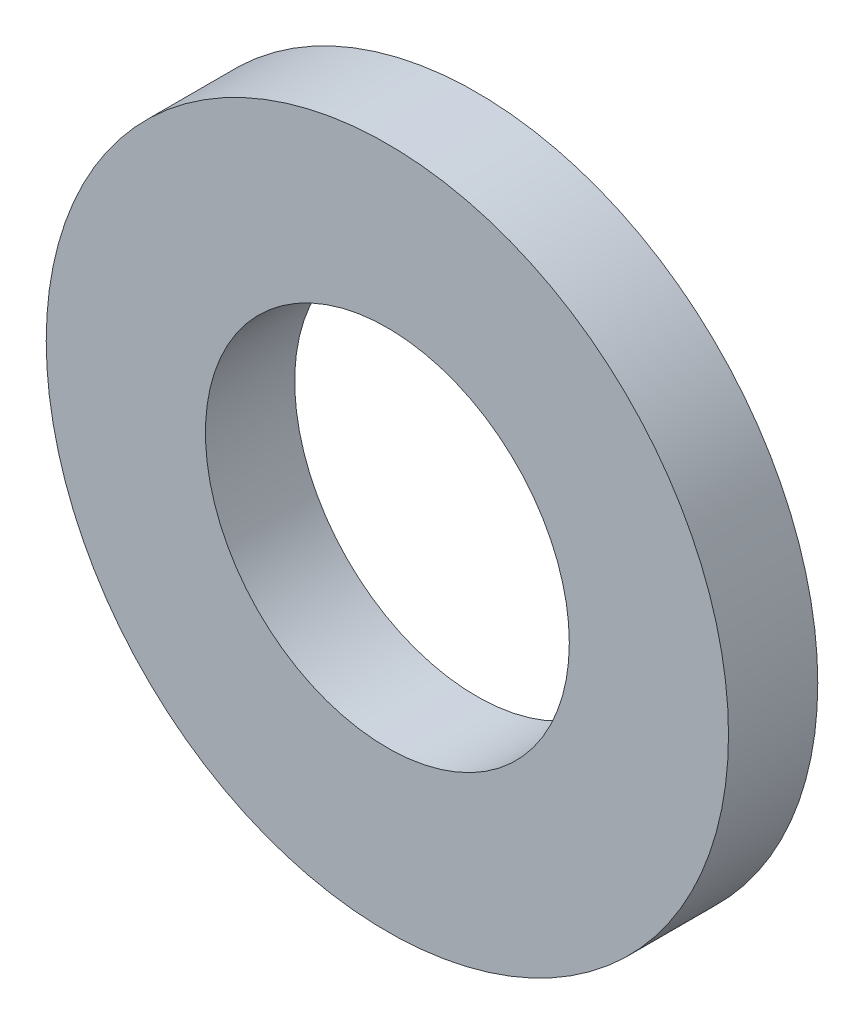
ISO-10303-21;
HEADER;
FILE_DESCRIPTION(('STEP AP214'),'2;1');
FILE_NAME('part.step','',(''),(''),'','','');
FILE_SCHEMA(('AUTOMOTIVE_DESIGN { 1 0 10303 214 1 1 1 1 }'));
ENDSEC;
DATA;
#1=APPLICATION_CONTEXT('core data for automotive mechanical design processes');
#2=APPLICATION_PROTOCOL_DEFINITION('international standard','automotive_design',2000,#1);
#3=PRODUCT_CONTEXT('',#1,'mechanical');
#4=PRODUCT('Part','Part','',(#3));
#5=PRODUCT_RELATED_PRODUCT_CATEGORY('part','',(#4));
#6=PRODUCT_DEFINITION_FORMATION('','',#4);
#7=PRODUCT_DEFINITION_CONTEXT('part definition',#1,'design');
#8=PRODUCT_DEFINITION('design','',#6,#7);
#9=PRODUCT_DEFINITION_SHAPE('','',#8);
#10=(LENGTH_UNIT() NAMED_UNIT(*) SI_UNIT(.MILLI.,.METRE.));
#11=(NAMED_UNIT(*) PLANE_ANGLE_UNIT() SI_UNIT($,.RADIAN.));
#12=(NAMED_UNIT(*) SI_UNIT($,.STERADIAN.) SOLID_ANGLE_UNIT());
#13=UNCERTAINTY_MEASURE_WITH_UNIT(LENGTH_MEASURE(1.E-05),#10,'distance_accuracy_value','');
#14=(GEOMETRIC_REPRESENTATION_CONTEXT(3) GLOBAL_UNCERTAINTY_ASSIGNED_CONTEXT((#13)) GLOBAL_UNIT_ASSIGNED_CONTEXT((#10,
#11,#12)) REPRESENTATION_CONTEXT('',''));
#15=CARTESIAN_POINT('',(0.,0.,0.));
#16=DIRECTION('',(0.,0.,1.));
#17=DIRECTION('',(1.,0.,0.));
#18=AXIS2_PLACEMENT_3D('',#15,#16,#17);
#19=CARTESIAN_POINT('',(0.,0.,-1.57));
#20=DIRECTION('',(0.,0.,1.));
#21=DIRECTION('',(1.,0.,0.));
#22=AXIS2_PLACEMENT_3D('',#19,#20,#21);
#23=CYLINDRICAL_SURFACE('',#22,6.);
#24=CARTESIAN_POINT('',(0.,0.,-1.57));
#25=DIRECTION('',(0.,0.,1.));
#26=DIRECTION('',(1.,0.,0.));
#27=AXIS2_PLACEMENT_3D('',#24,#25,#26);
#28=CIRCLE('',#27,6.);
#29=CARTESIAN_POINT('',(6.,0.,-1.57));
#30=VERTEX_POINT('',#29);
#31=EDGE_CURVE('E10',#30,#30,#28,.T.);
#32=ORIENTED_EDGE('',*,*,#31,.T.);
#33=EDGE_LOOP('',(#32));
#34=FACE_BOUND('',#33,.T.);
#35=CARTESIAN_POINT('',(0.,0.,0.));
#36=DIRECTION('',(0.,0.,1.));
#37=DIRECTION('',(1.,0.,0.));
#38=AXIS2_PLACEMENT_3D('',#35,#36,#37);
#39=CIRCLE('',#38,6.);
#40=CARTESIAN_POINT('',(6.,0.,0.));
#41=VERTEX_POINT('',#40);
#42=EDGE_CURVE('E33',#41,#41,#39,.T.);
#43=ORIENTED_EDGE('',*,*,#42,.F.);
#44=EDGE_LOOP('',(#43));
#45=FACE_BOUND('',#44,.T.);
#46=ADVANCED_FACE('F30',(#34,#45),#23,.T.);
#47=CARTESIAN_POINT('',(0.,0.,-1.57));
#48=DIRECTION('',(0.,0.,1.));
#49=DIRECTION('',(1.,0.,0.));
#50=AXIS2_PLACEMENT_3D('',#47,#48,#49);
#51=PLANE('',#50);
#52=CARTESIAN_POINT('',(0.,0.,-1.57));
#53=DIRECTION('',(0.,0.,1.));
#54=DIRECTION('',(1.,0.,0.));
#55=AXIS2_PLACEMENT_3D('',#52,#53,#54);
#56=CIRCLE('',#55,3.2);
#57=CARTESIAN_POINT('',(3.2,0.,-1.57));
#58=VERTEX_POINT('',#57);
#59=EDGE_CURVE('E40',#58,#58,#56,.T.);
#60=ORIENTED_EDGE('',*,*,#59,.T.);
#61=EDGE_LOOP('',(#60));
#62=FACE_BOUND('',#61,.T.);
#63=ORIENTED_EDGE('',*,*,#31,.F.);
#64=EDGE_LOOP('',(#63));
#65=FACE_BOUND('',#64,.T.);
#66=ADVANCED_FACE('F48',(#62,#65),#51,.F.);
#67=CARTESIAN_POINT('',(0.,0.,0.));
#68=DIRECTION('',(0.,0.,1.));
#69=DIRECTION('',(1.,0.,0.));
#70=AXIS2_PLACEMENT_3D('',#67,#68,#69);
#71=PLANE('',#70);
#72=CARTESIAN_POINT('',(0.,0.,0.));
#73=DIRECTION('',(0.,0.,1.));
#74=DIRECTION('',(1.,0.,0.));
#75=AXIS2_PLACEMENT_3D('',#72,#73,#74);
#76=CIRCLE('',#75,3.2);
#77=CARTESIAN_POINT('',(3.2,0.,0.));
#78=VERTEX_POINT('',#77);
#79=EDGE_CURVE('E42',#78,#78,#76,.T.);
#80=ORIENTED_EDGE('',*,*,#79,.F.);
#81=EDGE_LOOP('',(#80));
#82=FACE_BOUND('',#81,.T.);
#83=ORIENTED_EDGE('',*,*,#42,.T.);
#84=EDGE_LOOP('',(#83));
#85=FACE_BOUND('',#84,.T.);
#86=ADVANCED_FACE('F54',(#82,#85),#71,.T.);
#87=CARTESIAN_POINT('',(0.,0.,-1.57));
#88=DIRECTION('',(0.,0.,1.));
#89=DIRECTION('',(1.,0.,0.));
#90=AXIS2_PLACEMENT_3D('',#87,#88,#89);
#91=CYLINDRICAL_SURFACE('',#90,3.2);
#92=ORIENTED_EDGE('',*,*,#59,.F.);
#93=EDGE_LOOP('',(#92));
#94=FACE_BOUND('',#93,.T.);
#95=ORIENTED_EDGE('',*,*,#79,.T.);
#96=EDGE_LOOP('',(#95));
#97=FACE_BOUND('',#96,.T.);
#98=ADVANCED_FACE('F51',(#94,#97),#91,.F.);
#99=CLOSED_SHELL('',(#46,#66,#86,#98));
#100=MANIFOLD_SOLID_BREP('B2',#99);
#101=ADVANCED_BREP_SHAPE_REPRESENTATION('',(#18,#100),#14);
#102=SHAPE_DEFINITION_REPRESENTATION(#9,#101);
ENDSEC;
END-ISO-10303-21;
